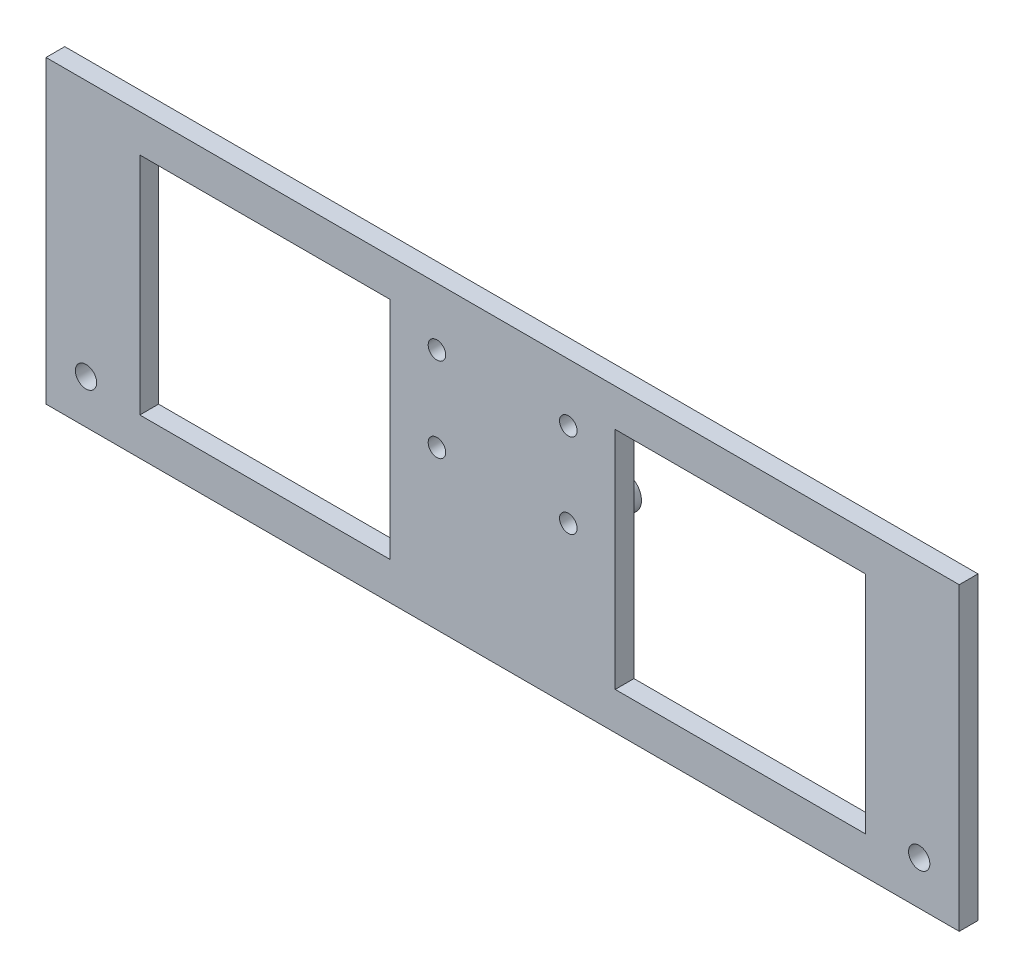
ISO-10303-21;
HEADER;
FILE_DESCRIPTION(('STEP AP214'),'2;1');
FILE_NAME('part.step','',(''),(''),'','','');
FILE_SCHEMA(('AUTOMOTIVE_DESIGN { 1 0 10303 214 1 1 1 1 }'));
ENDSEC;
DATA;
#1=APPLICATION_CONTEXT('core data for automotive mechanical design processes');
#2=APPLICATION_PROTOCOL_DEFINITION('international standard','automotive_design',2000,#1);
#3=PRODUCT_CONTEXT('',#1,'mechanical');
#4=PRODUCT('Part','Part','',(#3));
#5=PRODUCT_RELATED_PRODUCT_CATEGORY('part','',(#4));
#6=PRODUCT_DEFINITION_FORMATION('','',#4);
#7=PRODUCT_DEFINITION_CONTEXT('part definition',#1,'design');
#8=PRODUCT_DEFINITION('design','',#6,#7);
#9=PRODUCT_DEFINITION_SHAPE('','',#8);
#10=(LENGTH_UNIT() NAMED_UNIT(*) SI_UNIT(.MILLI.,.METRE.));
#11=(NAMED_UNIT(*) PLANE_ANGLE_UNIT() SI_UNIT($,.RADIAN.));
#12=(NAMED_UNIT(*) SI_UNIT($,.STERADIAN.) SOLID_ANGLE_UNIT());
#13=UNCERTAINTY_MEASURE_WITH_UNIT(LENGTH_MEASURE(1.E-05),#10,'distance_accuracy_value','');
#14=(GEOMETRIC_REPRESENTATION_CONTEXT(3) GLOBAL_UNCERTAINTY_ASSIGNED_CONTEXT((#13)) GLOBAL_UNIT_ASSIGNED_CONTEXT((#10,
#11,#12)) REPRESENTATION_CONTEXT('',''));
#15=CARTESIAN_POINT('',(0.,0.,0.));
#16=DIRECTION('',(0.,0.,1.));
#17=DIRECTION('',(1.,0.,0.));
#18=AXIS2_PLACEMENT_3D('',#15,#16,#17);
#19=CARTESIAN_POINT('',(0.,0.,0.));
#20=DIRECTION('',(0.,0.,-1.));
#21=DIRECTION('',(-1.,0.,0.));
#22=AXIS2_PLACEMENT_3D('',#19,#20,#21);
#23=PLANE('',#22);
#24=CARTESIAN_POINT('',(66.6,-25.,0.));
#25=DIRECTION('',(0.,0.,-1.));
#26=DIRECTION('',(-1.,0.,0.));
#27=AXIS2_PLACEMENT_3D('',#24,#25,#26);
#28=CIRCLE('',#27,1.69999999999999);
#29=CARTESIAN_POINT('',(64.9,-25.,0.));
#30=VERTEX_POINT('',#29);
#31=EDGE_CURVE('E512',#30,#30,#28,.T.);
#32=ORIENTED_EDGE('',*,*,#31,.F.);
#33=EDGE_LOOP('',(#32));
#34=FACE_BOUND('',#33,.T.);
#35=CARTESIAN_POINT('',(-66.6,-25.,0.));
#36=DIRECTION('',(0.,0.,-1.));
#37=DIRECTION('',(-1.,0.,0.));
#38=AXIS2_PLACEMENT_3D('',#35,#36,#37);
#39=CIRCLE('',#38,1.69999999999999);
#40=CARTESIAN_POINT('',(-68.3,-25.,0.));
#41=VERTEX_POINT('',#40);
#42=EDGE_CURVE('E535',#41,#41,#39,.T.);
#43=ORIENTED_EDGE('',*,*,#42,.F.);
#44=EDGE_LOOP('',(#43));
#45=FACE_BOUND('',#44,.T.);
#46=CARTESIAN_POINT('',(-10.5,6.75,0.));
#47=DIRECTION('',(0.,0.,1.));
#48=DIRECTION('',(1.,0.,0.));
#49=AXIS2_PLACEMENT_3D('',#46,#47,#48);
#50=CIRCLE('',#49,2.7);
#51=CARTESIAN_POINT('',(-7.8,6.75,0.));
#52=VERTEX_POINT('',#51);
#53=EDGE_CURVE('E546',#52,#52,#50,.T.);
#54=ORIENTED_EDGE('',*,*,#53,.T.);
#55=EDGE_LOOP('',(#54));
#56=FACE_BOUND('',#55,.T.);
#57=CARTESIAN_POINT('',(10.5,-6.75,0.));
#58=DIRECTION('',(0.,0.,1.));
#59=DIRECTION('',(1.,0.,0.));
#60=AXIS2_PLACEMENT_3D('',#57,#58,#59);
#61=CIRCLE('',#60,2.7);
#62=CARTESIAN_POINT('',(13.2,-6.75,0.));
#63=VERTEX_POINT('',#62);
#64=EDGE_CURVE('E539',#63,#63,#61,.T.);
#65=ORIENTED_EDGE('',*,*,#64,.T.);
#66=EDGE_LOOP('',(#65));
#67=FACE_BOUND('',#66,.T.);
#68=CARTESIAN_POINT('',(10.5,6.75,0.));
#69=DIRECTION('',(0.,0.,1.));
#70=DIRECTION('',(1.,0.,0.));
#71=AXIS2_PLACEMENT_3D('',#68,#69,#70);
#72=CIRCLE('',#71,2.7);
#73=CARTESIAN_POINT('',(13.2,6.75,0.));
#74=VERTEX_POINT('',#73);
#75=EDGE_CURVE('E536',#74,#74,#72,.T.);
#76=ORIENTED_EDGE('',*,*,#75,.T.);
#77=EDGE_LOOP('',(#76));
#78=FACE_BOUND('',#77,.T.);
#79=CARTESIAN_POINT('',(-10.5,-6.75,0.));
#80=DIRECTION('',(0.,0.,1.));
#81=DIRECTION('',(1.,0.,0.));
#82=AXIS2_PLACEMENT_3D('',#79,#80,#81);
#83=CIRCLE('',#82,2.7);
#84=CARTESIAN_POINT('',(-7.8,-6.75,0.));
#85=VERTEX_POINT('',#84);
#86=EDGE_CURVE('E208',#85,#85,#83,.T.);
#87=ORIENTED_EDGE('',*,*,#86,.T.);
#88=EDGE_LOOP('',(#87));
#89=FACE_BOUND('',#88,.T.);
#90=DIRECTION('',(0.,-1.,0.));
#91=VECTOR('',#90,1.);
#92=CARTESIAN_POINT('',(-73.,-32.,0.));
#93=LINE('',#92,#91);
#94=CARTESIAN_POINT('',(-73.,16.,0.));
#95=VERTEX_POINT('',#94);
#96=CARTESIAN_POINT('',(-73.,-32.,0.));
#97=VERTEX_POINT('',#96);
#98=EDGE_CURVE('E157',#95,#97,#93,.T.);
#99=ORIENTED_EDGE('',*,*,#98,.F.);
#100=DIRECTION('',(-1.,0.,0.));
#101=VECTOR('',#100,1.);
#102=CARTESIAN_POINT('',(-73.,16.,0.));
#103=LINE('',#102,#101);
#104=CARTESIAN_POINT('',(73.,16.,0.));
#105=VERTEX_POINT('',#104);
#106=EDGE_CURVE('E117',#105,#95,#103,.T.);
#107=ORIENTED_EDGE('',*,*,#106,.F.);
#108=DIRECTION('',(0.,1.,0.));
#109=VECTOR('',#108,1.);
#110=CARTESIAN_POINT('',(73.,-32.,0.));
#111=LINE('',#110,#109);
#112=CARTESIAN_POINT('',(73.,-32.,0.));
#113=VERTEX_POINT('',#112);
#114=EDGE_CURVE('E155',#113,#105,#111,.T.);
#115=ORIENTED_EDGE('',*,*,#114,.F.);
#116=DIRECTION('',(1.,0.,0.));
#117=VECTOR('',#116,1.);
#118=CARTESIAN_POINT('',(-73.,-32.,0.));
#119=LINE('',#118,#117);
#120=EDGE_CURVE('E105',#97,#113,#119,.T.);
#121=ORIENTED_EDGE('',*,*,#120,.F.);
#122=EDGE_LOOP('',(#99,#107,#115,#121));
#123=FACE_BOUND('',#122,.T.);
#124=DIRECTION('',(-1.,0.,0.));
#125=VECTOR('',#124,1.);
#126=CARTESIAN_POINT('',(0.,10.,0.));
#127=LINE('',#126,#125);
#128=CARTESIAN_POINT('',(58.,10.,0.));
#129=VERTEX_POINT('',#128);
#130=CARTESIAN_POINT('',(18.,10.,0.));
#131=VERTEX_POINT('',#130);
#132=EDGE_CURVE('E175',#129,#131,#127,.T.);
#133=ORIENTED_EDGE('',*,*,#132,.T.);
#134=DIRECTION('',(0.,1.,0.));
#135=VECTOR('',#134,1.);
#136=CARTESIAN_POINT('',(18.,0.,0.));
#137=LINE('',#136,#135);
#138=CARTESIAN_POINT('',(18.,-26.,0.));
#139=VERTEX_POINT('',#138);
#140=EDGE_CURVE('E166',#131,#139,#137,.F.);
#141=ORIENTED_EDGE('',*,*,#140,.T.);
#142=DIRECTION('',(-1.,0.,0.));
#143=VECTOR('',#142,1.);
#144=CARTESIAN_POINT('',(0.,-26.,0.));
#145=LINE('',#144,#143);
#146=CARTESIAN_POINT('',(58.,-26.,0.));
#147=VERTEX_POINT('',#146);
#148=EDGE_CURVE('E167',#139,#147,#145,.F.);
#149=ORIENTED_EDGE('',*,*,#148,.T.);
#150=DIRECTION('',(0.,1.,0.));
#151=VECTOR('',#150,1.);
#152=CARTESIAN_POINT('',(58.,0.,0.));
#153=LINE('',#152,#151);
#154=EDGE_CURVE('E168',#147,#129,#153,.T.);
#155=ORIENTED_EDGE('',*,*,#154,.T.);
#156=EDGE_LOOP('',(#133,#141,#149,#155));
#157=FACE_BOUND('',#156,.T.);
#158=DIRECTION('',(-1.,0.,0.));
#159=VECTOR('',#158,1.);
#160=CARTESIAN_POINT('',(0.,10.,0.));
#161=LINE('',#160,#159);
#162=CARTESIAN_POINT('',(-18.,10.,0.));
#163=VERTEX_POINT('',#162);
#164=CARTESIAN_POINT('',(-58.,10.,0.));
#165=VERTEX_POINT('',#164);
#166=EDGE_CURVE('E183',#163,#165,#161,.T.);
#167=ORIENTED_EDGE('',*,*,#166,.T.);
#168=DIRECTION('',(0.,1.,0.));
#169=VECTOR('',#168,1.);
#170=CARTESIAN_POINT('',(-58.,0.,0.));
#171=LINE('',#170,#169);
#172=CARTESIAN_POINT('',(-58.,-26.,0.));
#173=VERTEX_POINT('',#172);
#174=EDGE_CURVE('E50',#165,#173,#171,.F.);
#175=ORIENTED_EDGE('',*,*,#174,.T.);
#176=DIRECTION('',(-1.,0.,0.));
#177=VECTOR('',#176,1.);
#178=CARTESIAN_POINT('',(0.,-26.,0.));
#179=LINE('',#178,#177);
#180=CARTESIAN_POINT('',(-18.,-26.,0.));
#181=VERTEX_POINT('',#180);
#182=EDGE_CURVE('E178',#173,#181,#179,.F.);
#183=ORIENTED_EDGE('',*,*,#182,.T.);
#184=DIRECTION('',(0.,1.,0.));
#185=VECTOR('',#184,1.);
#186=CARTESIAN_POINT('',(-18.,0.,0.));
#187=LINE('',#186,#185);
#188=EDGE_CURVE('E181',#181,#163,#187,.T.);
#189=ORIENTED_EDGE('',*,*,#188,.T.);
#190=EDGE_LOOP('',(#167,#175,#183,#189));
#191=FACE_BOUND('',#190,.T.);
#192=ADVANCED_FACE('F43',(#34,#45,#56,#67,#78,#89,#123,#157,#191),#23,.T.);
#193=CARTESIAN_POINT('',(-73.,-32.,3.));
#194=DIRECTION('',(1.,0.,0.));
#195=DIRECTION('',(0.,0.,-1.));
#196=AXIS2_PLACEMENT_3D('',#193,#194,#195);
#197=PLANE('',#196);
#198=ORIENTED_EDGE('',*,*,#98,.T.);
#199=DIRECTION('',(0.,0.,-1.));
#200=VECTOR('',#199,1.);
#201=CARTESIAN_POINT('',(-73.,-32.,3.));
#202=LINE('',#201,#200);
#203=CARTESIAN_POINT('',(-73.,-32.,3.));
#204=VERTEX_POINT('',#203);
#205=EDGE_CURVE('E11',#204,#97,#202,.T.);
#206=ORIENTED_EDGE('',*,*,#205,.F.);
#207=DIRECTION('',(0.,-1.,0.));
#208=VECTOR('',#207,1.);
#209=CARTESIAN_POINT('',(-73.,-32.,3.));
#210=LINE('',#209,#208);
#211=CARTESIAN_POINT('',(-73.,16.,3.));
#212=VERTEX_POINT('',#211);
#213=EDGE_CURVE('E143',#212,#204,#210,.T.);
#214=ORIENTED_EDGE('',*,*,#213,.F.);
#215=DIRECTION('',(0.,0.,-1.));
#216=VECTOR('',#215,1.);
#217=CARTESIAN_POINT('',(-73.,16.,3.));
#218=LINE('',#217,#216);
#219=EDGE_CURVE('E141',#212,#95,#218,.T.);
#220=ORIENTED_EDGE('',*,*,#219,.T.);
#221=EDGE_LOOP('',(#198,#206,#214,#220));
#222=FACE_BOUND('',#221,.T.);
#223=ADVANCED_FACE('F44',(#222),#197,.F.);
#224=CARTESIAN_POINT('',(-73.,-32.,3.));
#225=DIRECTION('',(0.,1.,0.));
#226=DIRECTION('',(0.,0.,1.));
#227=AXIS2_PLACEMENT_3D('',#224,#225,#226);
#228=PLANE('',#227);
#229=ORIENTED_EDGE('',*,*,#120,.T.);
#230=DIRECTION('',(0.,0.,-1.));
#231=VECTOR('',#230,1.);
#232=CARTESIAN_POINT('',(73.,-32.,3.));
#233=LINE('',#232,#231);
#234=CARTESIAN_POINT('',(73.,-32.,3.));
#235=VERTEX_POINT('',#234);
#236=EDGE_CURVE('E52',#235,#113,#233,.T.);
#237=ORIENTED_EDGE('',*,*,#236,.F.);
#238=DIRECTION('',(1.,0.,0.));
#239=VECTOR('',#238,1.);
#240=CARTESIAN_POINT('',(-73.,-32.,3.));
#241=LINE('',#240,#239);
#242=EDGE_CURVE('E121',#204,#235,#241,.T.);
#243=ORIENTED_EDGE('',*,*,#242,.F.);
#244=ORIENTED_EDGE('',*,*,#205,.T.);
#245=EDGE_LOOP('',(#229,#237,#243,#244));
#246=FACE_BOUND('',#245,.T.);
#247=ADVANCED_FACE('F282',(#246),#228,.F.);
#248=CARTESIAN_POINT('',(73.,-32.,3.));
#249=DIRECTION('',(-1.,0.,0.));
#250=DIRECTION('',(0.,0.,1.));
#251=AXIS2_PLACEMENT_3D('',#248,#249,#250);
#252=PLANE('',#251);
#253=ORIENTED_EDGE('',*,*,#114,.T.);
#254=DIRECTION('',(0.,0.,-1.));
#255=VECTOR('',#254,1.);
#256=CARTESIAN_POINT('',(73.,16.,3.));
#257=LINE('',#256,#255);
#258=CARTESIAN_POINT('',(73.,16.,3.));
#259=VERTEX_POINT('',#258);
#260=EDGE_CURVE('E146',#259,#105,#257,.T.);
#261=ORIENTED_EDGE('',*,*,#260,.F.);
#262=DIRECTION('',(0.,1.,0.));
#263=VECTOR('',#262,1.);
#264=CARTESIAN_POINT('',(73.,-32.,3.));
#265=LINE('',#264,#263);
#266=EDGE_CURVE('E133',#235,#259,#265,.T.);
#267=ORIENTED_EDGE('',*,*,#266,.F.);
#268=ORIENTED_EDGE('',*,*,#236,.T.);
#269=EDGE_LOOP('',(#253,#261,#267,#268));
#270=FACE_BOUND('',#269,.T.);
#271=ADVANCED_FACE('F289',(#270),#252,.F.);
#272=CARTESIAN_POINT('',(-73.,16.,3.));
#273=DIRECTION('',(0.,-1.,0.));
#274=DIRECTION('',(0.,0.,-1.));
#275=AXIS2_PLACEMENT_3D('',#272,#273,#274);
#276=PLANE('',#275);
#277=ORIENTED_EDGE('',*,*,#106,.T.);
#278=ORIENTED_EDGE('',*,*,#219,.F.);
#279=DIRECTION('',(-1.,0.,0.));
#280=VECTOR('',#279,1.);
#281=CARTESIAN_POINT('',(-73.,16.,3.));
#282=LINE('',#281,#280);
#283=EDGE_CURVE('E140',#259,#212,#282,.T.);
#284=ORIENTED_EDGE('',*,*,#283,.F.);
#285=ORIENTED_EDGE('',*,*,#260,.T.);
#286=EDGE_LOOP('',(#277,#278,#284,#285));
#287=FACE_BOUND('',#286,.T.);
#288=ADVANCED_FACE('F144',(#287),#276,.F.);
#289=CARTESIAN_POINT('',(0.,0.,3.));
#290=DIRECTION('',(0.,0.,-1.));
#291=DIRECTION('',(-1.,0.,0.));
#292=AXIS2_PLACEMENT_3D('',#289,#290,#291);
#293=PLANE('',#292);
#294=CARTESIAN_POINT('',(66.6,-25.,3.));
#295=DIRECTION('',(0.,0.,1.));
#296=DIRECTION('',(1.,0.,0.));
#297=AXIS2_PLACEMENT_3D('',#294,#295,#296);
#298=CIRCLE('',#297,1.69999999999999);
#299=CARTESIAN_POINT('',(68.3,-25.,3.));
#300=VERTEX_POINT('',#299);
#301=EDGE_CURVE('E514',#300,#300,#298,.T.);
#302=ORIENTED_EDGE('',*,*,#301,.F.);
#303=EDGE_LOOP('',(#302));
#304=FACE_BOUND('',#303,.T.);
#305=CARTESIAN_POINT('',(-10.5,6.75,3.));
#306=DIRECTION('',(0.,0.,1.));
#307=DIRECTION('',(1.,0.,0.));
#308=AXIS2_PLACEMENT_3D('',#305,#306,#307);
#309=CIRCLE('',#308,1.4);
#310=CARTESIAN_POINT('',(-9.1,6.75,3.));
#311=VERTEX_POINT('',#310);
#312=EDGE_CURVE('E530',#311,#311,#309,.T.);
#313=ORIENTED_EDGE('',*,*,#312,.F.);
#314=EDGE_LOOP('',(#313));
#315=FACE_BOUND('',#314,.T.);
#316=CARTESIAN_POINT('',(10.5,-6.75,3.));
#317=DIRECTION('',(0.,0.,1.));
#318=DIRECTION('',(1.,0.,0.));
#319=AXIS2_PLACEMENT_3D('',#316,#317,#318);
#320=CIRCLE('',#319,1.4);
#321=CARTESIAN_POINT('',(11.9,-6.75,3.));
#322=VERTEX_POINT('',#321);
#323=EDGE_CURVE('E525',#322,#322,#320,.T.);
#324=ORIENTED_EDGE('',*,*,#323,.F.);
#325=EDGE_LOOP('',(#324));
#326=FACE_BOUND('',#325,.T.);
#327=CARTESIAN_POINT('',(10.5,6.75,3.));
#328=DIRECTION('',(0.,0.,1.));
#329=DIRECTION('',(1.,0.,0.));
#330=AXIS2_PLACEMENT_3D('',#327,#328,#329);
#331=CIRCLE('',#330,1.4);
#332=CARTESIAN_POINT('',(11.9,6.75,3.));
#333=VERTEX_POINT('',#332);
#334=EDGE_CURVE('E593',#333,#333,#331,.T.);
#335=ORIENTED_EDGE('',*,*,#334,.F.);
#336=EDGE_LOOP('',(#335));
#337=FACE_BOUND('',#336,.T.);
#338=CARTESIAN_POINT('',(-66.6,-25.,3.));
#339=DIRECTION('',(0.,0.,1.));
#340=DIRECTION('',(1.,0.,0.));
#341=AXIS2_PLACEMENT_3D('',#338,#339,#340);
#342=CIRCLE('',#341,1.69999999999999);
#343=CARTESIAN_POINT('',(-64.9,-25.,3.));
#344=VERTEX_POINT('',#343);
#345=EDGE_CURVE('E517',#344,#344,#342,.T.);
#346=ORIENTED_EDGE('',*,*,#345,.F.);
#347=EDGE_LOOP('',(#346));
#348=FACE_BOUND('',#347,.T.);
#349=CARTESIAN_POINT('',(-10.5,-6.75,3.));
#350=DIRECTION('',(0.,0.,1.));
#351=DIRECTION('',(1.,0.,0.));
#352=AXIS2_PLACEMENT_3D('',#349,#350,#351);
#353=CIRCLE('',#352,1.4);
#354=CARTESIAN_POINT('',(-9.1,-6.75,3.));
#355=VERTEX_POINT('',#354);
#356=EDGE_CURVE('E523',#355,#355,#353,.T.);
#357=ORIENTED_EDGE('',*,*,#356,.F.);
#358=EDGE_LOOP('',(#357));
#359=FACE_BOUND('',#358,.T.);
#360=DIRECTION('',(1.,0.,0.));
#361=VECTOR('',#360,1.);
#362=CARTESIAN_POINT('',(-58.,-26.,3.));
#363=LINE('',#362,#361);
#364=CARTESIAN_POINT('',(-58.,-26.,3.));
#365=VERTEX_POINT('',#364);
#366=CARTESIAN_POINT('',(-18.,-26.,3.));
#367=VERTEX_POINT('',#366);
#368=EDGE_CURVE('E236',#365,#367,#363,.T.);
#369=ORIENTED_EDGE('',*,*,#368,.F.);
#370=DIRECTION('',(0.,-1.,0.));
#371=VECTOR('',#370,1.);
#372=CARTESIAN_POINT('',(-58.,-26.,3.));
#373=LINE('',#372,#371);
#374=CARTESIAN_POINT('',(-58.,10.,3.));
#375=VERTEX_POINT('',#374);
#376=EDGE_CURVE('E64',#375,#365,#373,.T.);
#377=ORIENTED_EDGE('',*,*,#376,.F.);
#378=DIRECTION('',(-1.,0.,0.));
#379=VECTOR('',#378,1.);
#380=CARTESIAN_POINT('',(-58.,10.,3.));
#381=LINE('',#380,#379);
#382=CARTESIAN_POINT('',(-18.,10.,3.));
#383=VERTEX_POINT('',#382);
#384=EDGE_CURVE('E249',#383,#375,#381,.T.);
#385=ORIENTED_EDGE('',*,*,#384,.F.);
#386=DIRECTION('',(0.,1.,0.));
#387=VECTOR('',#386,1.);
#388=CARTESIAN_POINT('',(-18.,-26.,3.));
#389=LINE('',#388,#387);
#390=EDGE_CURVE('E238',#367,#383,#389,.T.);
#391=ORIENTED_EDGE('',*,*,#390,.F.);
#392=EDGE_LOOP('',(#369,#377,#385,#391));
#393=FACE_BOUND('',#392,.T.);
#394=DIRECTION('',(1.,0.,0.));
#395=VECTOR('',#394,1.);
#396=CARTESIAN_POINT('',(18.,-26.,3.));
#397=LINE('',#396,#395);
#398=CARTESIAN_POINT('',(18.,-26.,3.));
#399=VERTEX_POINT('',#398);
#400=CARTESIAN_POINT('',(58.,-26.,3.));
#401=VERTEX_POINT('',#400);
#402=EDGE_CURVE('E230',#399,#401,#397,.T.);
#403=ORIENTED_EDGE('',*,*,#402,.F.);
#404=DIRECTION('',(0.,-1.,0.));
#405=VECTOR('',#404,1.);
#406=CARTESIAN_POINT('',(18.,-26.,3.));
#407=LINE('',#406,#405);
#408=CARTESIAN_POINT('',(18.,10.,3.));
#409=VERTEX_POINT('',#408);
#410=EDGE_CURVE('E234',#409,#399,#407,.T.);
#411=ORIENTED_EDGE('',*,*,#410,.F.);
#412=DIRECTION('',(-1.,0.,0.));
#413=VECTOR('',#412,1.);
#414=CARTESIAN_POINT('',(18.,10.,3.));
#415=LINE('',#414,#413);
#416=CARTESIAN_POINT('',(58.,10.,3.));
#417=VERTEX_POINT('',#416);
#418=EDGE_CURVE('E176',#417,#409,#415,.T.);
#419=ORIENTED_EDGE('',*,*,#418,.F.);
#420=DIRECTION('',(0.,1.,0.));
#421=VECTOR('',#420,1.);
#422=CARTESIAN_POINT('',(58.,-26.,3.));
#423=LINE('',#422,#421);
#424=EDGE_CURVE('E225',#401,#417,#423,.T.);
#425=ORIENTED_EDGE('',*,*,#424,.F.);
#426=EDGE_LOOP('',(#403,#411,#419,#425));
#427=FACE_BOUND('',#426,.T.);
#428=ORIENTED_EDGE('',*,*,#213,.T.);
#429=ORIENTED_EDGE('',*,*,#242,.T.);
#430=ORIENTED_EDGE('',*,*,#266,.T.);
#431=ORIENTED_EDGE('',*,*,#283,.T.);
#432=EDGE_LOOP('',(#428,#429,#430,#431));
#433=FACE_BOUND('',#432,.T.);
#434=ADVANCED_FACE('F136',(#304,#315,#326,#337,#348,#359,#393,#427,#433),#293,.F.);
#435=CARTESIAN_POINT('',(18.,-26.,-1.2E-05));
#436=DIRECTION('',(-1.,0.,0.));
#437=DIRECTION('',(0.,0.,1.));
#438=AXIS2_PLACEMENT_3D('',#435,#436,#437);
#439=PLANE('',#438);
#440=DIRECTION('',(0.,0.,1.));
#441=VECTOR('',#440,1.);
#442=CARTESIAN_POINT('',(18.,-26.,-1.2E-05));
#443=LINE('',#442,#441);
#444=EDGE_CURVE('E177',#139,#399,#443,.T.);
#445=ORIENTED_EDGE('',*,*,#444,.F.);
#446=ORIENTED_EDGE('',*,*,#140,.F.);
#447=DIRECTION('',(0.,0.,1.));
#448=VECTOR('',#447,1.);
#449=CARTESIAN_POINT('',(18.,10.,-1.2E-05));
#450=LINE('',#449,#448);
#451=EDGE_CURVE('E204',#131,#409,#450,.T.);
#452=ORIENTED_EDGE('',*,*,#451,.T.);
#453=ORIENTED_EDGE('',*,*,#410,.T.);
#454=EDGE_LOOP('',(#445,#446,#452,#453));
#455=FACE_BOUND('',#454,.T.);
#456=ADVANCED_FACE('F265',(#455),#439,.F.);
#457=CARTESIAN_POINT('',(18.,10.,-1.2E-05));
#458=DIRECTION('',(0.,1.,0.));
#459=DIRECTION('',(0.,0.,1.));
#460=AXIS2_PLACEMENT_3D('',#457,#458,#459);
#461=PLANE('',#460);
#462=ORIENTED_EDGE('',*,*,#451,.F.);
#463=ORIENTED_EDGE('',*,*,#132,.F.);
#464=DIRECTION('',(0.,0.,1.));
#465=VECTOR('',#464,1.);
#466=CARTESIAN_POINT('',(58.,10.,-1.2E-05));
#467=LINE('',#466,#465);
#468=EDGE_CURVE('E210',#129,#417,#467,.T.);
#469=ORIENTED_EDGE('',*,*,#468,.T.);
#470=ORIENTED_EDGE('',*,*,#418,.T.);
#471=EDGE_LOOP('',(#462,#463,#469,#470));
#472=FACE_BOUND('',#471,.T.);
#473=ADVANCED_FACE('F263',(#472),#461,.F.);
#474=CARTESIAN_POINT('',(58.,-26.,-1.2E-05));
#475=DIRECTION('',(1.,0.,0.));
#476=DIRECTION('',(0.,0.,-1.));
#477=AXIS2_PLACEMENT_3D('',#474,#475,#476);
#478=PLANE('',#477);
#479=ORIENTED_EDGE('',*,*,#468,.F.);
#480=ORIENTED_EDGE('',*,*,#154,.F.);
#481=DIRECTION('',(0.,0.,1.));
#482=VECTOR('',#481,1.);
#483=CARTESIAN_POINT('',(58.,-26.,-1.2E-05));
#484=LINE('',#483,#482);
#485=EDGE_CURVE('E154',#147,#401,#484,.T.);
#486=ORIENTED_EDGE('',*,*,#485,.T.);
#487=ORIENTED_EDGE('',*,*,#424,.T.);
#488=EDGE_LOOP('',(#479,#480,#486,#487));
#489=FACE_BOUND('',#488,.T.);
#490=ADVANCED_FACE('F219',(#489),#478,.F.);
#491=CARTESIAN_POINT('',(18.,-26.,-1.2E-05));
#492=DIRECTION('',(0.,-1.,0.));
#493=DIRECTION('',(0.,0.,-1.));
#494=AXIS2_PLACEMENT_3D('',#491,#492,#493);
#495=PLANE('',#494);
#496=ORIENTED_EDGE('',*,*,#485,.F.);
#497=ORIENTED_EDGE('',*,*,#148,.F.);
#498=ORIENTED_EDGE('',*,*,#444,.T.);
#499=ORIENTED_EDGE('',*,*,#402,.T.);
#500=EDGE_LOOP('',(#496,#497,#498,#499));
#501=FACE_BOUND('',#500,.T.);
#502=ADVANCED_FACE('F226',(#501),#495,.F.);
#503=CARTESIAN_POINT('',(-58.,-26.,-1.2E-05));
#504=DIRECTION('',(-1.,0.,0.));
#505=DIRECTION('',(0.,0.,1.));
#506=AXIS2_PLACEMENT_3D('',#503,#504,#505);
#507=PLANE('',#506);
#508=DIRECTION('',(0.,0.,1.));
#509=VECTOR('',#508,1.);
#510=CARTESIAN_POINT('',(-58.,-26.,-1.2E-05));
#511=LINE('',#510,#509);
#512=EDGE_CURVE('E189',#173,#365,#511,.T.);
#513=ORIENTED_EDGE('',*,*,#512,.F.);
#514=ORIENTED_EDGE('',*,*,#174,.F.);
#515=DIRECTION('',(0.,0.,1.));
#516=VECTOR('',#515,1.);
#517=CARTESIAN_POINT('',(-58.,10.,-1.2E-05));
#518=LINE('',#517,#516);
#519=EDGE_CURVE('E91',#165,#375,#518,.T.);
#520=ORIENTED_EDGE('',*,*,#519,.T.);
#521=ORIENTED_EDGE('',*,*,#376,.T.);
#522=EDGE_LOOP('',(#513,#514,#520,#521));
#523=FACE_BOUND('',#522,.T.);
#524=ADVANCED_FACE('F248',(#523),#507,.F.);
#525=CARTESIAN_POINT('',(-58.,10.,-1.2E-05));
#526=DIRECTION('',(0.,1.,0.));
#527=DIRECTION('',(0.,0.,1.));
#528=AXIS2_PLACEMENT_3D('',#525,#526,#527);
#529=PLANE('',#528);
#530=ORIENTED_EDGE('',*,*,#519,.F.);
#531=ORIENTED_EDGE('',*,*,#166,.F.);
#532=DIRECTION('',(0.,0.,1.));
#533=VECTOR('',#532,1.);
#534=CARTESIAN_POINT('',(-18.,10.,-1.2E-05));
#535=LINE('',#534,#533);
#536=EDGE_CURVE('E197',#163,#383,#535,.T.);
#537=ORIENTED_EDGE('',*,*,#536,.T.);
#538=ORIENTED_EDGE('',*,*,#384,.T.);
#539=EDGE_LOOP('',(#530,#531,#537,#538));
#540=FACE_BOUND('',#539,.T.);
#541=ADVANCED_FACE('F345',(#540),#529,.F.);
#542=CARTESIAN_POINT('',(-18.,-26.,-1.2E-05));
#543=DIRECTION('',(1.,0.,0.));
#544=DIRECTION('',(0.,0.,-1.));
#545=AXIS2_PLACEMENT_3D('',#542,#543,#544);
#546=PLANE('',#545);
#547=ORIENTED_EDGE('',*,*,#536,.F.);
#548=ORIENTED_EDGE('',*,*,#188,.F.);
#549=DIRECTION('',(0.,0.,1.));
#550=VECTOR('',#549,1.);
#551=CARTESIAN_POINT('',(-18.,-26.,-1.2E-05));
#552=LINE('',#551,#550);
#553=EDGE_CURVE('E188',#181,#367,#552,.T.);
#554=ORIENTED_EDGE('',*,*,#553,.T.);
#555=ORIENTED_EDGE('',*,*,#390,.T.);
#556=EDGE_LOOP('',(#547,#548,#554,#555));
#557=FACE_BOUND('',#556,.T.);
#558=ADVANCED_FACE('F254',(#557),#546,.F.);
#559=CARTESIAN_POINT('',(-58.,-26.,-1.2E-05));
#560=DIRECTION('',(0.,-1.,0.));
#561=DIRECTION('',(0.,0.,-1.));
#562=AXIS2_PLACEMENT_3D('',#559,#560,#561);
#563=PLANE('',#562);
#564=ORIENTED_EDGE('',*,*,#553,.F.);
#565=ORIENTED_EDGE('',*,*,#182,.F.);
#566=ORIENTED_EDGE('',*,*,#512,.T.);
#567=ORIENTED_EDGE('',*,*,#368,.T.);
#568=EDGE_LOOP('',(#564,#565,#566,#567));
#569=FACE_BOUND('',#568,.T.);
#570=ADVANCED_FACE('F252',(#569),#563,.F.);
#571=CARTESIAN_POINT('',(-10.5,-6.75,0.));
#572=DIRECTION('',(0.,0.,-1.));
#573=DIRECTION('',(-1.,0.,0.));
#574=AXIS2_PLACEMENT_3D('',#571,#572,#573);
#575=CYLINDRICAL_SURFACE('',#574,2.7);
#576=ORIENTED_EDGE('',*,*,#86,.F.);
#577=EDGE_LOOP('',(#576));
#578=FACE_BOUND('',#577,.T.);
#579=CARTESIAN_POINT('',(-10.5,-6.75,-6.));
#580=DIRECTION('',(0.,0.,1.));
#581=DIRECTION('',(1.,0.,0.));
#582=AXIS2_PLACEMENT_3D('',#579,#580,#581);
#583=CIRCLE('',#582,2.7);
#584=CARTESIAN_POINT('',(-7.8,-6.75,-6.));
#585=VERTEX_POINT('',#584);
#586=EDGE_CURVE('E245',#585,#585,#583,.T.);
#587=ORIENTED_EDGE('',*,*,#586,.T.);
#588=EDGE_LOOP('',(#587));
#589=FACE_BOUND('',#588,.T.);
#590=ADVANCED_FACE('F366',(#578,#589),#575,.T.);
#591=CARTESIAN_POINT('',(-10.5,-6.75,-6.));
#592=DIRECTION('',(0.,0.,1.));
#593=DIRECTION('',(1.,0.,0.));
#594=AXIS2_PLACEMENT_3D('',#591,#592,#593);
#595=PLANE('',#594);
#596=CARTESIAN_POINT('',(-10.5,-6.75,-6.));
#597=DIRECTION('',(0.,0.,1.));
#598=DIRECTION('',(1.,0.,0.));
#599=AXIS2_PLACEMENT_3D('',#596,#597,#598);
#600=CIRCLE('',#599,1.4);
#601=CARTESIAN_POINT('',(-9.1,-6.75,-6.));
#602=VERTEX_POINT('',#601);
#603=EDGE_CURVE('E526',#602,#602,#600,.T.);
#604=ORIENTED_EDGE('',*,*,#603,.T.);
#605=EDGE_LOOP('',(#604));
#606=FACE_BOUND('',#605,.T.);
#607=ORIENTED_EDGE('',*,*,#586,.F.);
#608=EDGE_LOOP('',(#607));
#609=FACE_BOUND('',#608,.T.);
#610=ADVANCED_FACE('F380',(#606,#609),#595,.F.);
#611=CARTESIAN_POINT('',(10.5,6.75,0.));
#612=DIRECTION('',(0.,0.,-1.));
#613=DIRECTION('',(-1.,0.,0.));
#614=AXIS2_PLACEMENT_3D('',#611,#612,#613);
#615=CYLINDRICAL_SURFACE('',#614,2.7);
#616=ORIENTED_EDGE('',*,*,#75,.F.);
#617=EDGE_LOOP('',(#616));
#618=FACE_BOUND('',#617,.T.);
#619=CARTESIAN_POINT('',(10.5,6.75,-6.));
#620=DIRECTION('',(0.,0.,1.));
#621=DIRECTION('',(1.,0.,0.));
#622=AXIS2_PLACEMENT_3D('',#619,#620,#621);
#623=CIRCLE('',#622,2.7);
#624=CARTESIAN_POINT('',(13.2,6.75,-6.));
#625=VERTEX_POINT('',#624);
#626=EDGE_CURVE('E540',#625,#625,#623,.T.);
#627=ORIENTED_EDGE('',*,*,#626,.T.);
#628=EDGE_LOOP('',(#627));
#629=FACE_BOUND('',#628,.T.);
#630=ADVANCED_FACE('F389',(#618,#629),#615,.T.);
#631=CARTESIAN_POINT('',(10.5,6.75,-6.));
#632=DIRECTION('',(0.,0.,1.));
#633=DIRECTION('',(1.,0.,0.));
#634=AXIS2_PLACEMENT_3D('',#631,#632,#633);
#635=PLANE('',#634);
#636=CARTESIAN_POINT('',(10.5,6.75,-6.));
#637=DIRECTION('',(0.,0.,1.));
#638=DIRECTION('',(1.,0.,0.));
#639=AXIS2_PLACEMENT_3D('',#636,#637,#638);
#640=CIRCLE('',#639,1.4);
#641=CARTESIAN_POINT('',(11.9,6.75,-6.));
#642=VERTEX_POINT('',#641);
#643=EDGE_CURVE('E516',#642,#642,#640,.T.);
#644=ORIENTED_EDGE('',*,*,#643,.T.);
#645=EDGE_LOOP('',(#644));
#646=FACE_BOUND('',#645,.T.);
#647=ORIENTED_EDGE('',*,*,#626,.F.);
#648=EDGE_LOOP('',(#647));
#649=FACE_BOUND('',#648,.T.);
#650=ADVANCED_FACE('F400',(#646,#649),#635,.F.);
#651=CARTESIAN_POINT('',(10.5,-6.75,0.));
#652=DIRECTION('',(0.,0.,-1.));
#653=DIRECTION('',(-1.,0.,0.));
#654=AXIS2_PLACEMENT_3D('',#651,#652,#653);
#655=CYLINDRICAL_SURFACE('',#654,2.7);
#656=ORIENTED_EDGE('',*,*,#64,.F.);
#657=EDGE_LOOP('',(#656));
#658=FACE_BOUND('',#657,.T.);
#659=CARTESIAN_POINT('',(10.5,-6.75,-6.));
#660=DIRECTION('',(0.,0.,1.));
#661=DIRECTION('',(1.,0.,0.));
#662=AXIS2_PLACEMENT_3D('',#659,#660,#661);
#663=CIRCLE('',#662,2.7);
#664=CARTESIAN_POINT('',(13.2,-6.75,-6.));
#665=VERTEX_POINT('',#664);
#666=EDGE_CURVE('E548',#665,#665,#663,.T.);
#667=ORIENTED_EDGE('',*,*,#666,.T.);
#668=EDGE_LOOP('',(#667));
#669=FACE_BOUND('',#668,.T.);
#670=ADVANCED_FACE('F410',(#658,#669),#655,.T.);
#671=CARTESIAN_POINT('',(10.5,-6.75,-6.));
#672=DIRECTION('',(0.,0.,1.));
#673=DIRECTION('',(1.,0.,0.));
#674=AXIS2_PLACEMENT_3D('',#671,#672,#673);
#675=PLANE('',#674);
#676=CARTESIAN_POINT('',(10.5,-6.75,-6.));
#677=DIRECTION('',(0.,0.,1.));
#678=DIRECTION('',(1.,0.,0.));
#679=AXIS2_PLACEMENT_3D('',#676,#677,#678);
#680=CIRCLE('',#679,1.4);
#681=CARTESIAN_POINT('',(11.9,-6.75,-6.));
#682=VERTEX_POINT('',#681);
#683=EDGE_CURVE('E594',#682,#682,#680,.T.);
#684=ORIENTED_EDGE('',*,*,#683,.T.);
#685=EDGE_LOOP('',(#684));
#686=FACE_BOUND('',#685,.T.);
#687=ORIENTED_EDGE('',*,*,#666,.F.);
#688=EDGE_LOOP('',(#687));
#689=FACE_BOUND('',#688,.T.);
#690=ADVANCED_FACE('F416',(#686,#689),#675,.F.);
#691=CARTESIAN_POINT('',(-10.5,6.75,0.));
#692=DIRECTION('',(0.,0.,-1.));
#693=DIRECTION('',(-1.,0.,0.));
#694=AXIS2_PLACEMENT_3D('',#691,#692,#693);
#695=CYLINDRICAL_SURFACE('',#694,2.7);
#696=ORIENTED_EDGE('',*,*,#53,.F.);
#697=EDGE_LOOP('',(#696));
#698=FACE_BOUND('',#697,.T.);
#699=CARTESIAN_POINT('',(-10.5,6.75,-6.));
#700=DIRECTION('',(0.,0.,1.));
#701=DIRECTION('',(1.,0.,0.));
#702=AXIS2_PLACEMENT_3D('',#699,#700,#701);
#703=CIRCLE('',#702,2.7);
#704=CARTESIAN_POINT('',(-7.8,6.75,-6.));
#705=VERTEX_POINT('',#704);
#706=EDGE_CURVE('E543',#705,#705,#703,.T.);
#707=ORIENTED_EDGE('',*,*,#706,.T.);
#708=EDGE_LOOP('',(#707));
#709=FACE_BOUND('',#708,.T.);
#710=ADVANCED_FACE('F430',(#698,#709),#695,.T.);
#711=CARTESIAN_POINT('',(-10.5,6.75,-6.));
#712=DIRECTION('',(0.,0.,1.));
#713=DIRECTION('',(1.,0.,0.));
#714=AXIS2_PLACEMENT_3D('',#711,#712,#713);
#715=PLANE('',#714);
#716=CARTESIAN_POINT('',(-10.5,6.75,-6.));
#717=DIRECTION('',(0.,0.,1.));
#718=DIRECTION('',(1.,0.,0.));
#719=AXIS2_PLACEMENT_3D('',#716,#717,#718);
#720=CIRCLE('',#719,1.4);
#721=CARTESIAN_POINT('',(-9.1,6.75,-6.));
#722=VERTEX_POINT('',#721);
#723=EDGE_CURVE('E601',#722,#722,#720,.T.);
#724=ORIENTED_EDGE('',*,*,#723,.T.);
#725=EDGE_LOOP('',(#724));
#726=FACE_BOUND('',#725,.T.);
#727=ORIENTED_EDGE('',*,*,#706,.F.);
#728=EDGE_LOOP('',(#727));
#729=FACE_BOUND('',#728,.T.);
#730=ADVANCED_FACE('F440',(#726,#729),#715,.F.);
#731=CARTESIAN_POINT('',(-10.5,6.75,-6.));
#732=DIRECTION('',(0.,0.,1.));
#733=DIRECTION('',(1.,0.,0.));
#734=AXIS2_PLACEMENT_3D('',#731,#732,#733);
#735=CYLINDRICAL_SURFACE('',#734,1.4);
#736=ORIENTED_EDGE('',*,*,#723,.F.);
#737=EDGE_LOOP('',(#736));
#738=FACE_BOUND('',#737,.T.);
#739=ORIENTED_EDGE('',*,*,#312,.T.);
#740=EDGE_LOOP('',(#739));
#741=FACE_BOUND('',#740,.T.);
#742=ADVANCED_FACE('F447',(#738,#741),#735,.F.);
#743=CARTESIAN_POINT('',(10.5,-6.75,-6.));
#744=DIRECTION('',(0.,0.,1.));
#745=DIRECTION('',(1.,0.,0.));
#746=AXIS2_PLACEMENT_3D('',#743,#744,#745);
#747=CYLINDRICAL_SURFACE('',#746,1.4);
#748=ORIENTED_EDGE('',*,*,#683,.F.);
#749=EDGE_LOOP('',(#748));
#750=FACE_BOUND('',#749,.T.);
#751=ORIENTED_EDGE('',*,*,#323,.T.);
#752=EDGE_LOOP('',(#751));
#753=FACE_BOUND('',#752,.T.);
#754=ADVANCED_FACE('F457',(#750,#753),#747,.F.);
#755=CARTESIAN_POINT('',(10.5,6.75,-6.));
#756=DIRECTION('',(0.,0.,1.));
#757=DIRECTION('',(1.,0.,0.));
#758=AXIS2_PLACEMENT_3D('',#755,#756,#757);
#759=CYLINDRICAL_SURFACE('',#758,1.4);
#760=ORIENTED_EDGE('',*,*,#643,.F.);
#761=EDGE_LOOP('',(#760));
#762=FACE_BOUND('',#761,.T.);
#763=ORIENTED_EDGE('',*,*,#334,.T.);
#764=EDGE_LOOP('',(#763));
#765=FACE_BOUND('',#764,.T.);
#766=ADVANCED_FACE('F467',(#762,#765),#759,.F.);
#767=CARTESIAN_POINT('',(-10.5,-6.75,-6.));
#768=DIRECTION('',(0.,0.,1.));
#769=DIRECTION('',(1.,0.,0.));
#770=AXIS2_PLACEMENT_3D('',#767,#768,#769);
#771=CYLINDRICAL_SURFACE('',#770,1.4);
#772=ORIENTED_EDGE('',*,*,#603,.F.);
#773=EDGE_LOOP('',(#772));
#774=FACE_BOUND('',#773,.T.);
#775=ORIENTED_EDGE('',*,*,#356,.T.);
#776=EDGE_LOOP('',(#775));
#777=FACE_BOUND('',#776,.T.);
#778=ADVANCED_FACE('F478',(#774,#777),#771,.F.);
#779=CARTESIAN_POINT('',(-66.6,-25.,-6.));
#780=DIRECTION('',(0.,0.,1.));
#781=DIRECTION('',(1.,0.,0.));
#782=AXIS2_PLACEMENT_3D('',#779,#780,#781);
#783=CYLINDRICAL_SURFACE('',#782,1.69999999999999);
#784=ORIENTED_EDGE('',*,*,#42,.T.);
#785=EDGE_LOOP('',(#784));
#786=FACE_BOUND('',#785,.T.);
#787=ORIENTED_EDGE('',*,*,#345,.T.);
#788=EDGE_LOOP('',(#787));
#789=FACE_BOUND('',#788,.T.);
#790=ADVANCED_FACE('F486',(#786,#789),#783,.F.);
#791=CARTESIAN_POINT('',(66.6,-25.,-6.));
#792=DIRECTION('',(0.,0.,1.));
#793=DIRECTION('',(1.,0.,0.));
#794=AXIS2_PLACEMENT_3D('',#791,#792,#793);
#795=CYLINDRICAL_SURFACE('',#794,1.69999999999999);
#796=ORIENTED_EDGE('',*,*,#31,.T.);
#797=EDGE_LOOP('',(#796));
#798=FACE_BOUND('',#797,.T.);
#799=ORIENTED_EDGE('',*,*,#301,.T.);
#800=EDGE_LOOP('',(#799));
#801=FACE_BOUND('',#800,.T.);
#802=ADVANCED_FACE('F497',(#798,#801),#795,.F.);
#803=CLOSED_SHELL('',(#192,#223,#247,#271,#288,#434,#456,#473,#490,#502,#524,#541,#558,#570,
#590,#610,#630,#650,#670,#690,#710,#730,#742,#754,#766,#778,#790,#802));
#804=MANIFOLD_SOLID_BREP('B2',#803);
#805=ADVANCED_BREP_SHAPE_REPRESENTATION('',(#18,#804),#14);
#806=SHAPE_DEFINITION_REPRESENTATION(#9,#805);
ENDSEC;
END-ISO-10303-21;
